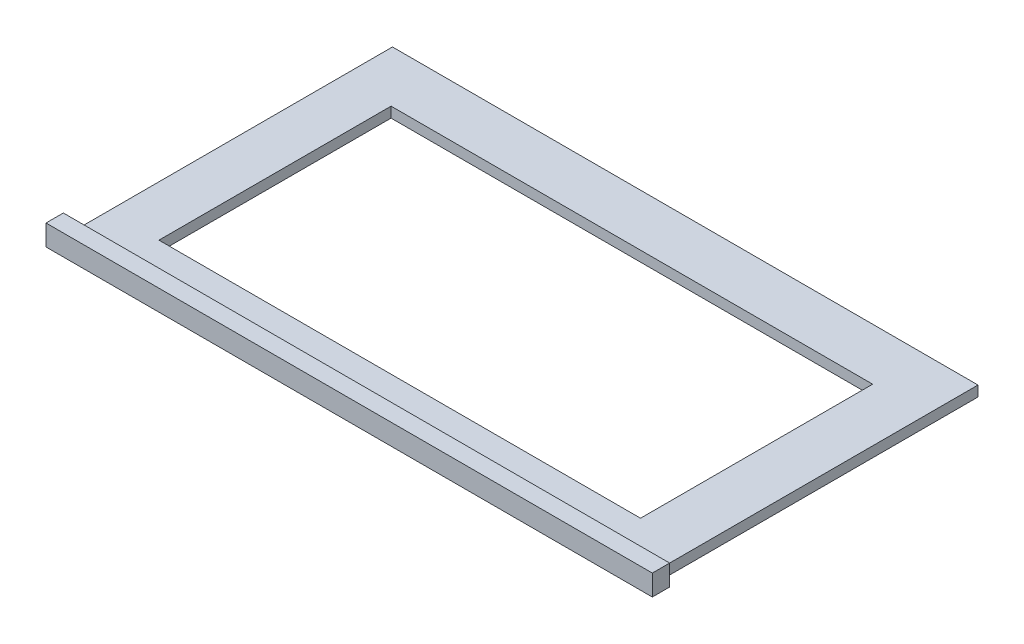
ISO-10303-21;
HEADER;
FILE_DESCRIPTION(('STEP AP214'),'2;1');
FILE_NAME('part.step','',(''),(''),'','','');
FILE_SCHEMA(('AUTOMOTIVE_DESIGN { 1 0 10303 214 1 1 1 1 }'));
ENDSEC;
DATA;
#1=APPLICATION_CONTEXT('core data for automotive mechanical design processes');
#2=APPLICATION_PROTOCOL_DEFINITION('international standard','automotive_design',2000,#1);
#3=PRODUCT_CONTEXT('',#1,'mechanical');
#4=PRODUCT('Part','Part','',(#3));
#5=PRODUCT_RELATED_PRODUCT_CATEGORY('part','',(#4));
#6=PRODUCT_DEFINITION_FORMATION('','',#4);
#7=PRODUCT_DEFINITION_CONTEXT('part definition',#1,'design');
#8=PRODUCT_DEFINITION('design','',#6,#7);
#9=PRODUCT_DEFINITION_SHAPE('','',#8);
#10=(LENGTH_UNIT() NAMED_UNIT(*) SI_UNIT(.MILLI.,.METRE.));
#11=(NAMED_UNIT(*) PLANE_ANGLE_UNIT() SI_UNIT($,.RADIAN.));
#12=(NAMED_UNIT(*) SI_UNIT($,.STERADIAN.) SOLID_ANGLE_UNIT());
#13=UNCERTAINTY_MEASURE_WITH_UNIT(LENGTH_MEASURE(1.E-05),#10,'distance_accuracy_value','');
#14=(GEOMETRIC_REPRESENTATION_CONTEXT(3) GLOBAL_UNCERTAINTY_ASSIGNED_CONTEXT((#13)) GLOBAL_UNIT_ASSIGNED_CONTEXT((#10,
#11,#12)) REPRESENTATION_CONTEXT('',''));
#15=CARTESIAN_POINT('',(0.,0.,0.));
#16=DIRECTION('',(0.,0.,1.));
#17=DIRECTION('',(1.,0.,0.));
#18=AXIS2_PLACEMENT_3D('',#15,#16,#17);
#19=CARTESIAN_POINT('',(84.5,-3.,-5.));
#20=DIRECTION('',(1.,0.,0.));
#21=DIRECTION('',(0.,0.,-1.));
#22=AXIS2_PLACEMENT_3D('',#19,#20,#21);
#23=PLANE('',#22);
#24=DIRECTION('',(0.,1.,0.));
#25=VECTOR('',#24,1.);
#26=CARTESIAN_POINT('',(84.5,3.,-5.));
#27=LINE('',#26,#25);
#28=CARTESIAN_POINT('',(84.5,-3.,-5.));
#29=VERTEX_POINT('',#28);
#30=CARTESIAN_POINT('',(84.5,0.,-5.));
#31=VERTEX_POINT('',#30);
#32=EDGE_CURVE('E197',#29,#31,#27,.T.);
#33=ORIENTED_EDGE('',*,*,#32,.F.);
#34=DIRECTION('',(0.,0.,1.));
#35=VECTOR('',#34,1.);
#36=CARTESIAN_POINT('',(84.5,-3.,-5.));
#37=LINE('',#36,#35);
#38=CARTESIAN_POINT('',(84.5,-3.,-97.));
#39=VERTEX_POINT('',#38);
#40=EDGE_CURVE('E48',#39,#29,#37,.T.);
#41=ORIENTED_EDGE('',*,*,#40,.F.);
#42=DIRECTION('',(0.,-1.,0.));
#43=VECTOR('',#42,1.);
#44=CARTESIAN_POINT('',(84.5,-3.,-97.));
#45=LINE('',#44,#43);
#46=CARTESIAN_POINT('',(84.5,0.,-97.));
#47=VERTEX_POINT('',#46);
#48=EDGE_CURVE('E221',#47,#39,#45,.T.);
#49=ORIENTED_EDGE('',*,*,#48,.F.);
#50=DIRECTION('',(0.,0.,1.));
#51=VECTOR('',#50,1.);
#52=CARTESIAN_POINT('',(84.5,0.,-97.));
#53=LINE('',#52,#51);
#54=EDGE_CURVE('E235',#47,#31,#53,.T.);
#55=ORIENTED_EDGE('',*,*,#54,.T.);
#56=EDGE_LOOP('',(#33,#41,#49,#55));
#57=FACE_BOUND('',#56,.T.);
#58=ADVANCED_FACE('F39',(#57),#23,.T.);
#59=CARTESIAN_POINT('',(-84.5,-3.,-5.));
#60=DIRECTION('',(0.,-1.,0.));
#61=DIRECTION('',(0.,0.,-1.));
#62=AXIS2_PLACEMENT_3D('',#59,#60,#61);
#63=PLANE('',#62);
#64=DIRECTION('',(0.,0.,1.));
#65=VECTOR('',#64,1.);
#66=CARTESIAN_POINT('',(-69.9086971470216,-3.,-82.0045271082427));
#67=LINE('',#66,#65);
#68=CARTESIAN_POINT('',(-69.9086971470216,-3.,-82.0045271082427));
#69=VERTEX_POINT('',#68);
#70=CARTESIAN_POINT('',(-69.9086971470216,-3.,-15.0045271082427));
#71=VERTEX_POINT('',#70);
#72=EDGE_CURVE('E132',#69,#71,#67,.T.);
#73=ORIENTED_EDGE('',*,*,#72,.T.);
#74=DIRECTION('',(1.,0.,0.));
#75=VECTOR('',#74,1.);
#76=CARTESIAN_POINT('',(69.0913028529784,-3.,-15.0045271082427));
#77=LINE('',#76,#75);
#78=CARTESIAN_POINT('',(69.0913028529784,-3.,-15.0045271082427));
#79=VERTEX_POINT('',#78);
#80=EDGE_CURVE('E142',#71,#79,#77,.T.);
#81=ORIENTED_EDGE('',*,*,#80,.T.);
#82=DIRECTION('',(0.,0.,-1.));
#83=VECTOR('',#82,1.);
#84=CARTESIAN_POINT('',(69.0913028529784,-3.,-82.0045271082427));
#85=LINE('',#84,#83);
#86=CARTESIAN_POINT('',(69.0913028529784,-3.,-82.0045271082427));
#87=VERTEX_POINT('',#86);
#88=EDGE_CURVE('E56',#79,#87,#85,.T.);
#89=ORIENTED_EDGE('',*,*,#88,.T.);
#90=DIRECTION('',(-1.,0.,0.));
#91=VECTOR('',#90,1.);
#92=CARTESIAN_POINT('',(69.0913028529784,-3.,-82.0045271082427));
#93=LINE('',#92,#91);
#94=EDGE_CURVE('E139',#87,#69,#93,.T.);
#95=ORIENTED_EDGE('',*,*,#94,.T.);
#96=EDGE_LOOP('',(#73,#81,#89,#95));
#97=FACE_BOUND('',#96,.T.);
#98=DIRECTION('',(1.,0.,0.));
#99=VECTOR('',#98,1.);
#100=CARTESIAN_POINT('',(-84.5,-3.,0.));
#101=LINE('',#100,#99);
#102=CARTESIAN_POINT('',(-87.5,-3.,0.));
#103=VERTEX_POINT('',#102);
#104=CARTESIAN_POINT('',(87.5,-3.,0.));
#105=VERTEX_POINT('',#104);
#106=EDGE_CURVE('E249',#103,#105,#101,.T.);
#107=ORIENTED_EDGE('',*,*,#106,.F.);
#108=DIRECTION('',(0.,0.,1.));
#109=VECTOR('',#108,1.);
#110=CARTESIAN_POINT('',(-87.5,-3.,0.));
#111=LINE('',#110,#109);
#112=CARTESIAN_POINT('',(-87.5,-3.,-5.00000000000002));
#113=VERTEX_POINT('',#112);
#114=EDGE_CURVE('E189',#113,#103,#111,.T.);
#115=ORIENTED_EDGE('',*,*,#114,.F.);
#116=DIRECTION('',(1.,0.,0.));
#117=VECTOR('',#116,1.);
#118=CARTESIAN_POINT('',(-87.5,-3.,-5.00000000000002));
#119=LINE('',#118,#117);
#120=CARTESIAN_POINT('',(-84.5,-3.,-5.00000000000002));
#121=VERTEX_POINT('',#120);
#122=EDGE_CURVE('E192',#113,#121,#119,.T.);
#123=ORIENTED_EDGE('',*,*,#122,.T.);
#124=DIRECTION('',(0.,0.,1.));
#125=VECTOR('',#124,1.);
#126=CARTESIAN_POINT('',(-84.5,-3.,-5.));
#127=LINE('',#126,#125);
#128=CARTESIAN_POINT('',(-84.5,-3.,-97.));
#129=VERTEX_POINT('',#128);
#130=EDGE_CURVE('E42',#129,#121,#127,.T.);
#131=ORIENTED_EDGE('',*,*,#130,.F.);
#132=DIRECTION('',(-1.,0.,0.));
#133=VECTOR('',#132,1.);
#134=CARTESIAN_POINT('',(84.5,-3.,-97.));
#135=LINE('',#134,#133);
#136=EDGE_CURVE('E225',#39,#129,#135,.T.);
#137=ORIENTED_EDGE('',*,*,#136,.F.);
#138=ORIENTED_EDGE('',*,*,#40,.T.);
#139=DIRECTION('',(-1.,0.,0.));
#140=VECTOR('',#139,1.);
#141=CARTESIAN_POINT('',(87.5,-3.,-5.));
#142=LINE('',#141,#140);
#143=CARTESIAN_POINT('',(87.5,-3.,-5.));
#144=VERTEX_POINT('',#143);
#145=EDGE_CURVE('E213',#144,#29,#142,.T.);
#146=ORIENTED_EDGE('',*,*,#145,.F.);
#147=DIRECTION('',(0.,0.,-1.));
#148=VECTOR('',#147,1.);
#149=CARTESIAN_POINT('',(87.5,-3.,-5.));
#150=LINE('',#149,#148);
#151=EDGE_CURVE('E210',#105,#144,#150,.T.);
#152=ORIENTED_EDGE('',*,*,#151,.F.);
#153=EDGE_LOOP('',(#107,#115,#123,#131,#137,#138,#146,#152));
#154=FACE_BOUND('',#153,.T.);
#155=ADVANCED_FACE('F147',(#97,#154),#63,.T.);
#156=CARTESIAN_POINT('',(-84.5,-3.,-5.));
#157=DIRECTION('',(-1.,0.,0.));
#158=DIRECTION('',(0.,0.,1.));
#159=AXIS2_PLACEMENT_3D('',#156,#157,#158);
#160=PLANE('',#159);
#161=DIRECTION('',(0.,-1.,0.));
#162=VECTOR('',#161,1.);
#163=CARTESIAN_POINT('',(-84.5,3.,-5.00000000000002));
#164=LINE('',#163,#162);
#165=CARTESIAN_POINT('',(-84.5,0.,-5.));
#166=VERTEX_POINT('',#165);
#167=EDGE_CURVE('E11',#166,#121,#164,.T.);
#168=ORIENTED_EDGE('',*,*,#167,.F.);
#169=DIRECTION('',(0.,0.,1.));
#170=VECTOR('',#169,1.);
#171=CARTESIAN_POINT('',(-84.5,0.,-97.));
#172=LINE('',#171,#170);
#173=CARTESIAN_POINT('',(-84.5,0.,-97.));
#174=VERTEX_POINT('',#173);
#175=EDGE_CURVE('E241',#174,#166,#172,.T.);
#176=ORIENTED_EDGE('',*,*,#175,.F.);
#177=DIRECTION('',(0.,1.,0.));
#178=VECTOR('',#177,1.);
#179=CARTESIAN_POINT('',(-84.5,-3.,-97.));
#180=LINE('',#179,#178);
#181=EDGE_CURVE('E229',#129,#174,#180,.T.);
#182=ORIENTED_EDGE('',*,*,#181,.F.);
#183=ORIENTED_EDGE('',*,*,#130,.T.);
#184=EDGE_LOOP('',(#168,#176,#182,#183));
#185=FACE_BOUND('',#184,.T.);
#186=ADVANCED_FACE('F260',(#185),#160,.T.);
#187=CARTESIAN_POINT('',(-84.5,3.,-5.));
#188=DIRECTION('',(0.,1.,0.));
#189=DIRECTION('',(0.,0.,1.));
#190=AXIS2_PLACEMENT_3D('',#187,#188,#189);
#191=PLANE('',#190);
#192=DIRECTION('',(-1.,0.,0.));
#193=VECTOR('',#192,1.);
#194=CARTESIAN_POINT('',(-84.5,3.,0.));
#195=LINE('',#194,#193);
#196=CARTESIAN_POINT('',(87.5,3.,0.));
#197=VERTEX_POINT('',#196);
#198=CARTESIAN_POINT('',(-87.5,3.,0.));
#199=VERTEX_POINT('',#198);
#200=EDGE_CURVE('E245',#197,#199,#195,.T.);
#201=ORIENTED_EDGE('',*,*,#200,.F.);
#202=DIRECTION('',(0.,0.,1.));
#203=VECTOR('',#202,1.);
#204=CARTESIAN_POINT('',(87.5,3.,-5.));
#205=LINE('',#204,#203);
#206=CARTESIAN_POINT('',(87.5,3.,-5.));
#207=VERTEX_POINT('',#206);
#208=EDGE_CURVE('E202',#207,#197,#205,.T.);
#209=ORIENTED_EDGE('',*,*,#208,.F.);
#210=DIRECTION('',(-1.,0.,0.));
#211=VECTOR('',#210,1.);
#212=CARTESIAN_POINT('',(-84.5,3.,-5.));
#213=LINE('',#212,#211);
#214=CARTESIAN_POINT('',(-87.5,3.,-5.00000000000002));
#215=VERTEX_POINT('',#214);
#216=EDGE_CURVE('E246',#207,#215,#213,.T.);
#217=ORIENTED_EDGE('',*,*,#216,.T.);
#218=DIRECTION('',(0.,0.,-1.));
#219=VECTOR('',#218,1.);
#220=CARTESIAN_POINT('',(-87.5,3.,0.));
#221=LINE('',#220,#219);
#222=EDGE_CURVE('E182',#199,#215,#221,.T.);
#223=ORIENTED_EDGE('',*,*,#222,.F.);
#224=EDGE_LOOP('',(#201,#209,#217,#223));
#225=FACE_BOUND('',#224,.T.);
#226=ADVANCED_FACE('F278',(#225),#191,.T.);
#227=CARTESIAN_POINT('',(0.,0.,-5.));
#228=DIRECTION('',(0.,0.,-1.));
#229=DIRECTION('',(-1.,0.,0.));
#230=AXIS2_PLACEMENT_3D('',#227,#228,#229);
#231=PLANE('',#230);
#232=DIRECTION('',(1.,0.,0.));
#233=VECTOR('',#232,1.);
#234=CARTESIAN_POINT('',(84.5,0.,-5.));
#235=LINE('',#234,#233);
#236=EDGE_CURVE('E220',#166,#31,#235,.T.);
#237=ORIENTED_EDGE('',*,*,#236,.F.);
#238=ORIENTED_EDGE('',*,*,#167,.T.);
#239=ORIENTED_EDGE('',*,*,#122,.F.);
#240=DIRECTION('',(0.,-1.,0.));
#241=VECTOR('',#240,1.);
#242=CARTESIAN_POINT('',(-87.5,3.,-5.00000000000002));
#243=LINE('',#242,#241);
#244=EDGE_CURVE('E186',#215,#113,#243,.T.);
#245=ORIENTED_EDGE('',*,*,#244,.F.);
#246=ORIENTED_EDGE('',*,*,#216,.F.);
#247=DIRECTION('',(0.,1.,0.));
#248=VECTOR('',#247,1.);
#249=CARTESIAN_POINT('',(87.5,3.,-5.));
#250=LINE('',#249,#248);
#251=EDGE_CURVE('E198',#144,#207,#250,.T.);
#252=ORIENTED_EDGE('',*,*,#251,.F.);
#253=ORIENTED_EDGE('',*,*,#145,.T.);
#254=ORIENTED_EDGE('',*,*,#32,.T.);
#255=EDGE_LOOP('',(#237,#238,#239,#245,#246,#252,#253,#254));
#256=FACE_BOUND('',#255,.T.);
#257=ADVANCED_FACE('F265',(#256),#231,.T.);
#258=CARTESIAN_POINT('',(0.,0.,0.));
#259=DIRECTION('',(0.,0.,-1.));
#260=DIRECTION('',(-1.,0.,0.));
#261=AXIS2_PLACEMENT_3D('',#258,#259,#260);
#262=PLANE('',#261);
#263=ORIENTED_EDGE('',*,*,#106,.T.);
#264=DIRECTION('',(0.,-1.,0.));
#265=VECTOR('',#264,1.);
#266=CARTESIAN_POINT('',(87.5,3.,0.));
#267=LINE('',#266,#265);
#268=EDGE_CURVE('E206',#197,#105,#267,.T.);
#269=ORIENTED_EDGE('',*,*,#268,.F.);
#270=ORIENTED_EDGE('',*,*,#200,.T.);
#271=DIRECTION('',(0.,1.,0.));
#272=VECTOR('',#271,1.);
#273=CARTESIAN_POINT('',(-87.5,3.,0.));
#274=LINE('',#273,#272);
#275=EDGE_CURVE('E173',#103,#199,#274,.T.);
#276=ORIENTED_EDGE('',*,*,#275,.F.);
#277=EDGE_LOOP('',(#263,#269,#270,#276));
#278=FACE_BOUND('',#277,.T.);
#279=ADVANCED_FACE('F273',(#278),#262,.F.);
#280=CARTESIAN_POINT('',(84.5,0.,-97.));
#281=DIRECTION('',(0.,-1.,0.));
#282=DIRECTION('',(0.,0.,-1.));
#283=AXIS2_PLACEMENT_3D('',#280,#281,#282);
#284=PLANE('',#283);
#285=DIRECTION('',(1.,0.,0.));
#286=VECTOR('',#285,1.);
#287=CARTESIAN_POINT('',(69.0913028529784,0.,-15.0045271082427));
#288=LINE('',#287,#286);
#289=CARTESIAN_POINT('',(-69.9086971470216,0.,-15.0045271082427));
#290=VERTEX_POINT('',#289);
#291=CARTESIAN_POINT('',(69.0913028529784,0.,-15.0045271082427));
#292=VERTEX_POINT('',#291);
#293=EDGE_CURVE('E164',#290,#292,#288,.T.);
#294=ORIENTED_EDGE('',*,*,#293,.F.);
#295=DIRECTION('',(0.,0.,1.));
#296=VECTOR('',#295,1.);
#297=CARTESIAN_POINT('',(-69.9086971470216,0.,-82.0045271082427));
#298=LINE('',#297,#296);
#299=CARTESIAN_POINT('',(-69.9086971470216,0.,-82.0045271082427));
#300=VERTEX_POINT('',#299);
#301=EDGE_CURVE('E64',#300,#290,#298,.T.);
#302=ORIENTED_EDGE('',*,*,#301,.F.);
#303=DIRECTION('',(-1.,0.,0.));
#304=VECTOR('',#303,1.);
#305=CARTESIAN_POINT('',(69.0913028529784,0.,-82.0045271082427));
#306=LINE('',#305,#304);
#307=CARTESIAN_POINT('',(69.0913028529784,0.,-82.0045271082427));
#308=VERTEX_POINT('',#307);
#309=EDGE_CURVE('E151',#308,#300,#306,.T.);
#310=ORIENTED_EDGE('',*,*,#309,.F.);
#311=DIRECTION('',(0.,0.,-1.));
#312=VECTOR('',#311,1.);
#313=CARTESIAN_POINT('',(69.0913028529784,0.,-82.0045271082427));
#314=LINE('',#313,#312);
#315=EDGE_CURVE('E155',#292,#308,#314,.T.);
#316=ORIENTED_EDGE('',*,*,#315,.F.);
#317=EDGE_LOOP('',(#294,#302,#310,#316));
#318=FACE_BOUND('',#317,.T.);
#319=ORIENTED_EDGE('',*,*,#236,.T.);
#320=ORIENTED_EDGE('',*,*,#54,.F.);
#321=DIRECTION('',(1.,0.,0.));
#322=VECTOR('',#321,1.);
#323=CARTESIAN_POINT('',(84.5,0.,-97.));
#324=LINE('',#323,#322);
#325=EDGE_CURVE('E232',#174,#47,#324,.T.);
#326=ORIENTED_EDGE('',*,*,#325,.F.);
#327=ORIENTED_EDGE('',*,*,#175,.T.);
#328=EDGE_LOOP('',(#319,#320,#326,#327));
#329=FACE_BOUND('',#328,.T.);
#330=ADVANCED_FACE('F287',(#318,#329),#284,.F.);
#331=CARTESIAN_POINT('',(0.,0.,-97.));
#332=DIRECTION('',(0.,0.,1.));
#333=DIRECTION('',(1.,0.,0.));
#334=AXIS2_PLACEMENT_3D('',#331,#332,#333);
#335=PLANE('',#334);
#336=ORIENTED_EDGE('',*,*,#48,.T.);
#337=ORIENTED_EDGE('',*,*,#136,.T.);
#338=ORIENTED_EDGE('',*,*,#181,.T.);
#339=ORIENTED_EDGE('',*,*,#325,.T.);
#340=EDGE_LOOP('',(#336,#337,#338,#339));
#341=FACE_BOUND('',#340,.T.);
#342=ADVANCED_FACE('F289',(#341),#335,.F.);
#343=CARTESIAN_POINT('',(87.5,0.,0.));
#344=DIRECTION('',(-1.,0.,0.));
#345=DIRECTION('',(0.,0.,1.));
#346=AXIS2_PLACEMENT_3D('',#343,#344,#345);
#347=PLANE('',#346);
#348=ORIENTED_EDGE('',*,*,#251,.T.);
#349=ORIENTED_EDGE('',*,*,#208,.T.);
#350=ORIENTED_EDGE('',*,*,#268,.T.);
#351=ORIENTED_EDGE('',*,*,#151,.T.);
#352=EDGE_LOOP('',(#348,#349,#350,#351));
#353=FACE_BOUND('',#352,.T.);
#354=ADVANCED_FACE('F281',(#353),#347,.F.);
#355=CARTESIAN_POINT('',(-87.5,0.,0.));
#356=DIRECTION('',(1.,0.,0.));
#357=DIRECTION('',(0.,0.,-1.));
#358=AXIS2_PLACEMENT_3D('',#355,#356,#357);
#359=PLANE('',#358);
#360=ORIENTED_EDGE('',*,*,#275,.T.);
#361=ORIENTED_EDGE('',*,*,#222,.T.);
#362=ORIENTED_EDGE('',*,*,#244,.T.);
#363=ORIENTED_EDGE('',*,*,#114,.T.);
#364=EDGE_LOOP('',(#360,#361,#362,#363));
#365=FACE_BOUND('',#364,.T.);
#366=ADVANCED_FACE('F271',(#365),#359,.F.);
#367=CARTESIAN_POINT('',(-69.9086971470216,-3.,-82.0045271082427));
#368=DIRECTION('',(-1.,0.,0.));
#369=DIRECTION('',(0.,0.,1.));
#370=AXIS2_PLACEMENT_3D('',#367,#368,#369);
#371=PLANE('',#370);
#372=ORIENTED_EDGE('',*,*,#301,.T.);
#373=DIRECTION('',(0.,1.,0.));
#374=VECTOR('',#373,1.);
#375=CARTESIAN_POINT('',(-69.9086971470216,-3.,-15.0045271082427));
#376=LINE('',#375,#374);
#377=EDGE_CURVE('E128',#71,#290,#376,.T.);
#378=ORIENTED_EDGE('',*,*,#377,.F.);
#379=ORIENTED_EDGE('',*,*,#72,.F.);
#380=DIRECTION('',(0.,1.,0.));
#381=VECTOR('',#380,1.);
#382=CARTESIAN_POINT('',(-69.9086971470216,-3.,-82.0045271082427));
#383=LINE('',#382,#381);
#384=EDGE_CURVE('E170',#69,#300,#383,.T.);
#385=ORIENTED_EDGE('',*,*,#384,.T.);
#386=EDGE_LOOP('',(#372,#378,#379,#385));
#387=FACE_BOUND('',#386,.T.);
#388=ADVANCED_FACE('F130',(#387),#371,.F.);
#389=CARTESIAN_POINT('',(69.0913028529784,-3.,-82.0045271082427));
#390=DIRECTION('',(0.,0.,-1.));
#391=DIRECTION('',(-1.,0.,0.));
#392=AXIS2_PLACEMENT_3D('',#389,#390,#391);
#393=PLANE('',#392);
#394=ORIENTED_EDGE('',*,*,#309,.T.);
#395=ORIENTED_EDGE('',*,*,#384,.F.);
#396=ORIENTED_EDGE('',*,*,#94,.F.);
#397=DIRECTION('',(0.,1.,0.));
#398=VECTOR('',#397,1.);
#399=CARTESIAN_POINT('',(69.0913028529784,-3.,-82.0045271082427));
#400=LINE('',#399,#398);
#401=EDGE_CURVE('E174',#87,#308,#400,.T.);
#402=ORIENTED_EDGE('',*,*,#401,.T.);
#403=EDGE_LOOP('',(#394,#395,#396,#402));
#404=FACE_BOUND('',#403,.T.);
#405=ADVANCED_FACE('F337',(#404),#393,.F.);
#406=CARTESIAN_POINT('',(69.0913028529784,-3.,-82.0045271082427));
#407=DIRECTION('',(1.,0.,0.));
#408=DIRECTION('',(0.,0.,-1.));
#409=AXIS2_PLACEMENT_3D('',#406,#407,#408);
#410=PLANE('',#409);
#411=ORIENTED_EDGE('',*,*,#315,.T.);
#412=ORIENTED_EDGE('',*,*,#401,.F.);
#413=ORIENTED_EDGE('',*,*,#88,.F.);
#414=DIRECTION('',(0.,1.,0.));
#415=VECTOR('',#414,1.);
#416=CARTESIAN_POINT('',(69.0913028529784,-3.,-15.0045271082427));
#417=LINE('',#416,#415);
#418=EDGE_CURVE('E138',#79,#292,#417,.T.);
#419=ORIENTED_EDGE('',*,*,#418,.T.);
#420=EDGE_LOOP('',(#411,#412,#413,#419));
#421=FACE_BOUND('',#420,.T.);
#422=ADVANCED_FACE('F348',(#421),#410,.F.);
#423=CARTESIAN_POINT('',(69.0913028529784,-3.,-15.0045271082427));
#424=DIRECTION('',(0.,0.,1.));
#425=DIRECTION('',(1.,0.,0.));
#426=AXIS2_PLACEMENT_3D('',#423,#424,#425);
#427=PLANE('',#426);
#428=ORIENTED_EDGE('',*,*,#293,.T.);
#429=ORIENTED_EDGE('',*,*,#418,.F.);
#430=ORIENTED_EDGE('',*,*,#80,.F.);
#431=ORIENTED_EDGE('',*,*,#377,.T.);
#432=EDGE_LOOP('',(#428,#429,#430,#431));
#433=FACE_BOUND('',#432,.T.);
#434=ADVANCED_FACE('F143',(#433),#427,.F.);
#435=CLOSED_SHELL('',(#58,#155,#186,#226,#257,#279,#330,#342,#354,#366,#388,#405,#422,#434));
#436=MANIFOLD_SOLID_BREP('B2',#435);
#437=ADVANCED_BREP_SHAPE_REPRESENTATION('',(#18,#436),#14);
#438=SHAPE_DEFINITION_REPRESENTATION(#9,#437);
ENDSEC;
END-ISO-10303-21;
